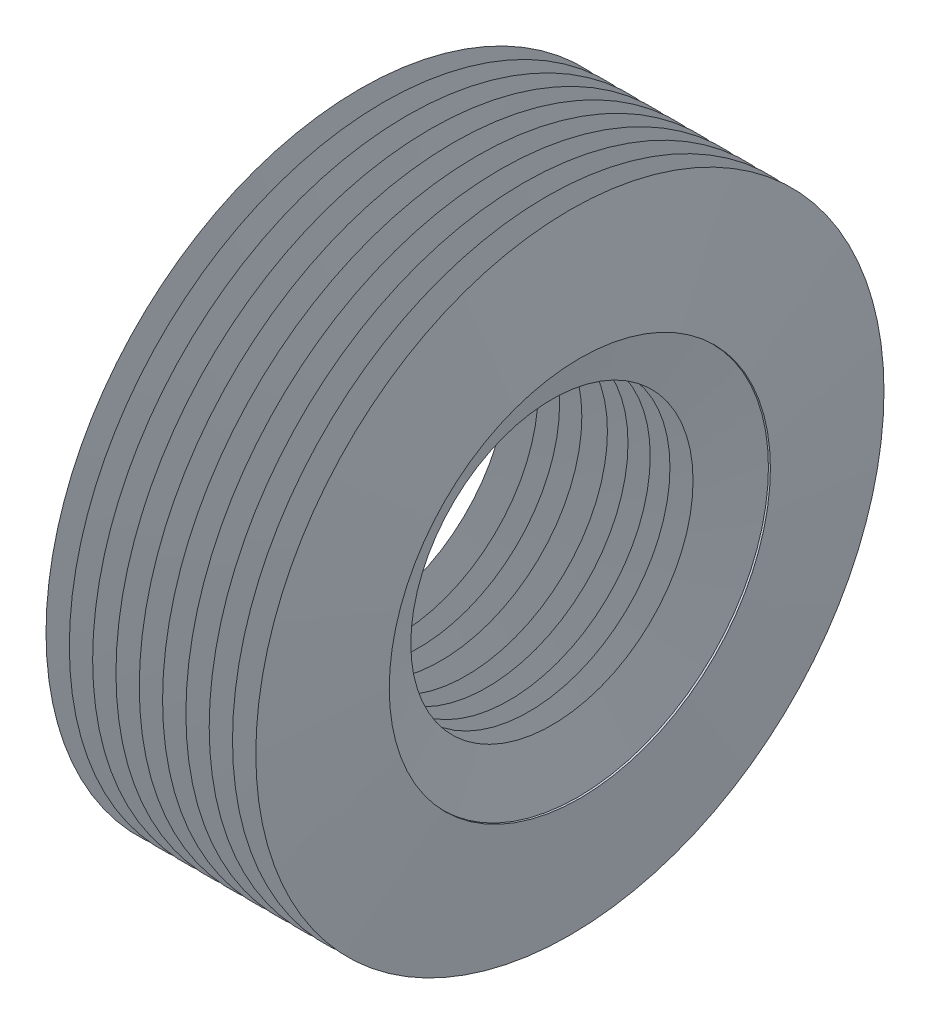
ISO-10303-21;
HEADER;
FILE_DESCRIPTION(('STEP AP214'),'2;1');
FILE_NAME('part.step','',(''),(''),'','','');
FILE_SCHEMA(('AUTOMOTIVE_DESIGN { 1 0 10303 214 1 1 1 1 }'));
ENDSEC;
DATA;
#1=APPLICATION_CONTEXT('core data for automotive mechanical design processes');
#2=APPLICATION_PROTOCOL_DEFINITION('international standard','automotive_design',2000,#1);
#3=PRODUCT_CONTEXT('',#1,'mechanical');
#4=PRODUCT('Part','Part','',(#3));
#5=PRODUCT_RELATED_PRODUCT_CATEGORY('part','',(#4));
#6=PRODUCT_DEFINITION_FORMATION('','',#4);
#7=PRODUCT_DEFINITION_CONTEXT('part definition',#1,'design');
#8=PRODUCT_DEFINITION('design','',#6,#7);
#9=PRODUCT_DEFINITION_SHAPE('','',#8);
#10=(LENGTH_UNIT() NAMED_UNIT(*) SI_UNIT(.MILLI.,.METRE.));
#11=(NAMED_UNIT(*) PLANE_ANGLE_UNIT() SI_UNIT($,.RADIAN.));
#12=(NAMED_UNIT(*) SI_UNIT($,.STERADIAN.) SOLID_ANGLE_UNIT());
#13=UNCERTAINTY_MEASURE_WITH_UNIT(LENGTH_MEASURE(1.E-05),#10,'distance_accuracy_value','');
#14=(GEOMETRIC_REPRESENTATION_CONTEXT(3) GLOBAL_UNCERTAINTY_ASSIGNED_CONTEXT((#13)) GLOBAL_UNIT_ASSIGNED_CONTEXT((#10,
#11,#12)) REPRESENTATION_CONTEXT('',''));
#15=CARTESIAN_POINT('',(0.,0.,0.));
#16=DIRECTION('',(0.,0.,1.));
#17=DIRECTION('',(1.,0.,0.));
#18=AXIS2_PLACEMENT_3D('',#15,#16,#17);
#19=CARTESIAN_POINT('',(1.27478020675698,0.,0.));
#20=DIRECTION('',(-1.,0.,0.));
#21=DIRECTION('',(0.,-1.,0.));
#22=AXIS2_PLACEMENT_3D('',#19,#20,#21);
#23=CONICAL_SURFACE('',#22,11.7519225936863,1.52376665433172);
#24=CARTESIAN_POINT('',(1.55124668778939,0.,0.));
#25=DIRECTION('',(1.,0.,0.));
#26=DIRECTION('',(0.,0.,-1.));
#27=AXIS2_PLACEMENT_3D('',#24,#25,#26);
#28=CIRCLE('',#27,5.87770302365698);
#29=CARTESIAN_POINT('',(1.55124668778939,0.,-5.87770302365698));
#30=VERTEX_POINT('',#29);
#31=EDGE_CURVE('E141',#30,#30,#28,.T.);
#32=ORIENTED_EDGE('',*,*,#31,.T.);
#33=EDGE_LOOP('',(#32));
#34=FACE_BOUND('',#33,.T.);
#35=CARTESIAN_POINT('',(1.27478020675699,0.,0.));
#36=DIRECTION('',(1.,0.,0.));
#37=DIRECTION('',(0.,0.,-1.));
#38=AXIS2_PLACEMENT_3D('',#35,#36,#37);
#39=CIRCLE('',#38,11.7519225936863);
#40=CARTESIAN_POINT('',(1.27478020675699,0.,-11.7519225936863));
#41=VERTEX_POINT('',#40);
#42=EDGE_CURVE('E17',#41,#41,#39,.F.);
#43=ORIENTED_EDGE('',*,*,#42,.T.);
#44=EDGE_LOOP('',(#43));
#45=FACE_BOUND('',#44,.T.);
#46=ADVANCED_FACE('F14',(#34,#45),#23,.F.);
#47=CARTESIAN_POINT('',(1.27478020675699,0.,0.));
#48=DIRECTION('',(1.,0.,0.));
#49=DIRECTION('',(0.,1.,0.));
#50=AXIS2_PLACEMENT_3D('',#47,#48,#49);
#51=CONICAL_SURFACE('',#50,11.7519225936863,1.5031032092826);
#52=CARTESIAN_POINT('',(1.01582547881265,0.,0.));
#53=DIRECTION('',(-1.,0.,0.));
#54=DIRECTION('',(0.,0.,1.));
#55=AXIS2_PLACEMENT_3D('',#52,#53,#54);
#56=CIRCLE('',#55,7.93234572300825);
#57=CARTESIAN_POINT('',(1.01582547881265,0.,7.93234572300825));
#58=VERTEX_POINT('',#57);
#59=EDGE_CURVE('E139',#58,#58,#56,.T.);
#60=ORIENTED_EDGE('',*,*,#59,.T.);
#61=EDGE_LOOP('',(#60));
#62=FACE_BOUND('',#61,.T.);
#63=ORIENTED_EDGE('',*,*,#42,.F.);
#64=EDGE_LOOP('',(#63));
#65=FACE_BOUND('',#64,.T.);
#66=ADVANCED_FACE('F149',(#62,#65),#51,.F.);
#67=CARTESIAN_POINT('',(2.25192698304255,0.,0.));
#68=DIRECTION('',(1.,0.,0.));
#69=DIRECTION('',(0.,1.,0.));
#70=AXIS2_PLACEMENT_3D('',#67,#68,#69);
#71=CONICAL_SURFACE('',#70,12.30922593993,1.4622796088312);
#72=ORIENTED_EDGE('',*,*,#31,.F.);
#73=EDGE_LOOP('',(#72));
#74=FACE_BOUND('',#73,.T.);
#75=CARTESIAN_POINT('',(2.25192698304316,0.,0.));
#76=DIRECTION('',(-1.,0.,0.));
#77=DIRECTION('',(0.,0.,1.));
#78=AXIS2_PLACEMENT_3D('',#75,#76,#77);
#79=CIRCLE('',#78,12.3092259400365);
#80=CARTESIAN_POINT('',(2.25192698304316,0.,12.3092259400365));
#81=VERTEX_POINT('',#80);
#82=EDGE_CURVE('E136',#81,#81,#79,.F.);
#83=ORIENTED_EDGE('',*,*,#82,.T.);
#84=EDGE_LOOP('',(#83));
#85=FACE_BOUND('',#84,.T.);
#86=ADVANCED_FACE('F151',(#74,#85),#71,.F.);
#87=CARTESIAN_POINT('',(0.939800000000007,0.,0.));
#88=DIRECTION('',(-1.,0.,0.));
#89=DIRECTION('',(0.,-1.,0.));
#90=AXIS2_PLACEMENT_3D('',#87,#88,#89);
#91=CONICAL_SURFACE('',#90,7.9375,0.0676931175123013);
#92=ORIENTED_EDGE('',*,*,#59,.F.);
#93=EDGE_LOOP('',(#92));
#94=FACE_BOUND('',#93,.T.);
#95=CARTESIAN_POINT('',(0.939800000000005,0.,0.));
#96=DIRECTION('',(1.,0.,0.));
#97=DIRECTION('',(0.,0.,-1.));
#98=AXIS2_PLACEMENT_3D('',#95,#96,#97);
#99=CIRCLE('',#98,7.9375);
#100=CARTESIAN_POINT('',(0.939800000000005,0.,-7.9375));
#101=VERTEX_POINT('',#100);
#102=EDGE_CURVE('E133',#101,#101,#99,.T.);
#103=ORIENTED_EDGE('',*,*,#102,.F.);
#104=EDGE_LOOP('',(#103));
#105=FACE_BOUND('',#104,.T.);
#106=ADVANCED_FACE('F158',(#94,#105),#91,.F.);
#107=CARTESIAN_POINT('',(2.25192698304316,0.,0.));
#108=DIRECTION('',(-1.,0.,0.));
#109=DIRECTION('',(0.,-1.,0.));
#110=AXIS2_PLACEMENT_3D('',#107,#108,#109);
#111=CONICAL_SURFACE('',#110,12.3092259400365,1.48153287638625);
#112=CARTESIAN_POINT('',(2.82752085367832,0.,0.));
#113=DIRECTION('',(1.,0.,0.));
#114=DIRECTION('',(0.,0.,-1.));
#115=AXIS2_PLACEMENT_3D('',#112,#113,#114);
#116=CIRCLE('',#115,5.87810228330454);
#117=CARTESIAN_POINT('',(2.82752085367832,0.,-5.87810228330454));
#118=VERTEX_POINT('',#117);
#119=EDGE_CURVE('E130',#118,#118,#116,.T.);
#120=ORIENTED_EDGE('',*,*,#119,.T.);
#121=EDGE_LOOP('',(#120));
#122=FACE_BOUND('',#121,.T.);
#123=ORIENTED_EDGE('',*,*,#82,.F.);
#124=EDGE_LOOP('',(#123));
#125=FACE_BOUND('',#124,.T.);
#126=ADVANCED_FACE('F311',(#122,#125),#111,.F.);
#127=CARTESIAN_POINT('',(1.28851235434653,0.,0.));
#128=DIRECTION('',(1.,0.,0.));
#129=DIRECTION('',(0.,1.,0.));
#130=AXIS2_PLACEMENT_3D('',#127,#128,#129);
#131=CONICAL_SURFACE('',#130,13.081,1.5031032092826);
#132=CARTESIAN_POINT('',(1.28851235434653,0.,0.));
#133=DIRECTION('',(-1.,0.,0.));
#134=DIRECTION('',(0.,0.,1.));
#135=AXIS2_PLACEMENT_3D('',#132,#133,#134);
#136=CIRCLE('',#135,13.081);
#137=CARTESIAN_POINT('',(1.28851235434653,0.,13.081));
#138=VERTEX_POINT('',#137);
#139=EDGE_CURVE('E127',#138,#138,#136,.F.);
#140=ORIENTED_EDGE('',*,*,#139,.F.);
#141=EDGE_LOOP('',(#140));
#142=FACE_BOUND('',#141,.T.);
#143=ORIENTED_EDGE('',*,*,#102,.T.);
#144=EDGE_LOOP('',(#143));
#145=FACE_BOUND('',#144,.T.);
#146=ADVANCED_FACE('F307',(#142,#145),#131,.T.);
#147=CARTESIAN_POINT('',(3.23648234410712,0.,0.));
#148=DIRECTION('',(1.,0.,0.));
#149=DIRECTION('',(0.,1.,0.));
#150=AXIS2_PLACEMENT_3D('',#147,#148,#149);
#151=CONICAL_SURFACE('',#150,12.0271798123213,1.50438634913583);
#152=ORIENTED_EDGE('',*,*,#119,.F.);
#153=EDGE_LOOP('',(#152));
#154=FACE_BOUND('',#153,.T.);
#155=CARTESIAN_POINT('',(3.23648234409971,0.,0.));
#156=DIRECTION('',(-1.,0.,0.));
#157=DIRECTION('',(0.,0.,1.));
#158=AXIS2_PLACEMENT_3D('',#155,#156,#157);
#159=CIRCLE('',#158,12.0271798123064);
#160=CARTESIAN_POINT('',(3.23648234409971,0.,12.0271798123064));
#161=VERTEX_POINT('',#160);
#162=EDGE_CURVE('E124',#161,#161,#159,.F.);
#163=ORIENTED_EDGE('',*,*,#162,.T.);
#164=EDGE_LOOP('',(#163));
#165=FACE_BOUND('',#164,.T.);
#166=ADVANCED_FACE('F303',(#154,#165),#151,.F.);
#167=CARTESIAN_POINT('',(1.28851235434653,0.,0.));
#168=DIRECTION('',(-1.,0.,0.));
#169=DIRECTION('',(0.,-1.,0.));
#170=AXIS2_PLACEMENT_3D('',#167,#168,#169);
#171=CONICAL_SURFACE('',#170,13.081,1.52376665433172);
#172=ORIENTED_EDGE('',*,*,#139,.T.);
#173=EDGE_LOOP('',(#172));
#174=FACE_BOUND('',#173,.T.);
#175=CARTESIAN_POINT('',(1.58139396881296,0.,0.));
#176=DIRECTION('',(1.,0.,0.));
#177=DIRECTION('',(0.,0.,-1.));
#178=AXIS2_PLACEMENT_3D('',#175,#176,#177);
#179=CIRCLE('',#178,6.85800000002246);
#180=CARTESIAN_POINT('',(1.58139396881296,0.,-6.85800000002246));
#181=VERTEX_POINT('',#180);
#182=EDGE_CURVE('E121',#181,#181,#179,.T.);
#183=ORIENTED_EDGE('',*,*,#182,.F.);
#184=EDGE_LOOP('',(#183));
#185=FACE_BOUND('',#184,.T.);
#186=ADVANCED_FACE('F299',(#174,#185),#171,.T.);
#187=CARTESIAN_POINT('',(3.23648234409971,0.,0.));
#188=DIRECTION('',(-1.,0.,0.));
#189=DIRECTION('',(0.,-1.,0.));
#190=AXIS2_PLACEMENT_3D('',#187,#188,#189);
#191=CONICAL_SURFACE('',#190,12.0271798123064,1.49246585917078);
#192=CARTESIAN_POINT('',(3.71912497512739,0.,0.));
#193=DIRECTION('',(1.,0.,0.));
#194=DIRECTION('',(0.,0.,-1.));
#195=AXIS2_PLACEMENT_3D('',#192,#193,#194);
#196=CIRCLE('',#195,5.87816614074654);
#197=CARTESIAN_POINT('',(3.71912497512739,0.,-5.87816614074654));
#198=VERTEX_POINT('',#197);
#199=EDGE_CURVE('E118',#198,#198,#196,.T.);
#200=ORIENTED_EDGE('',*,*,#199,.T.);
#201=EDGE_LOOP('',(#200));
#202=FACE_BOUND('',#201,.T.);
#203=ORIENTED_EDGE('',*,*,#162,.F.);
#204=EDGE_LOOP('',(#203));
#205=FACE_BOUND('',#204,.T.);
#206=ADVANCED_FACE('F295',(#202,#205),#191,.F.);
#207=CARTESIAN_POINT('',(2.2593567987883,0.,0.));
#208=DIRECTION('',(1.,0.,0.));
#209=DIRECTION('',(0.,1.,0.));
#210=AXIS2_PLACEMENT_3D('',#207,#208,#209);
#211=CONICAL_SURFACE('',#210,13.0809999999997,1.46227960883077);
#212=CARTESIAN_POINT('',(2.25935679879097,0.,0.));
#213=DIRECTION('',(-1.,0.,0.));
#214=DIRECTION('',(0.,0.,1.));
#215=AXIS2_PLACEMENT_3D('',#212,#213,#214);
#216=CIRCLE('',#215,13.081);
#217=CARTESIAN_POINT('',(2.25935679879097,0.,13.081));
#218=VERTEX_POINT('',#217);
#219=EDGE_CURVE('E115',#218,#218,#216,.F.);
#220=ORIENTED_EDGE('',*,*,#219,.F.);
#221=EDGE_LOOP('',(#220));
#222=FACE_BOUND('',#221,.T.);
#223=ORIENTED_EDGE('',*,*,#182,.T.);
#224=EDGE_LOOP('',(#223));
#225=FACE_BOUND('',#224,.T.);
#226=ADVANCED_FACE('F291',(#222,#225),#211,.T.);
#227=CARTESIAN_POINT('',(4.19840654571146,0.,0.));
#228=DIRECTION('',(1.,0.,0.));
#229=DIRECTION('',(0.,1.,0.));
#230=AXIS2_PLACEMENT_3D('',#227,#228,#229);
#231=CONICAL_SURFACE('',#230,12.0610080238635,1.49343303358597);
#232=ORIENTED_EDGE('',*,*,#199,.F.);
#233=EDGE_LOOP('',(#232));
#234=FACE_BOUND('',#233,.T.);
#235=CARTESIAN_POINT('',(4.19840654571653,0.,0.));
#236=DIRECTION('',(-1.,0.,0.));
#237=DIRECTION('',(0.,0.,1.));
#238=AXIS2_PLACEMENT_3D('',#235,#236,#237);
#239=CIRCLE('',#238,12.0610080239029);
#240=CARTESIAN_POINT('',(4.19840654571653,0.,12.0610080239029));
#241=VERTEX_POINT('',#240);
#242=EDGE_CURVE('E112',#241,#241,#239,.F.);
#243=ORIENTED_EDGE('',*,*,#242,.T.);
#244=EDGE_LOOP('',(#243));
#245=FACE_BOUND('',#244,.T.);
#246=ADVANCED_FACE('F287',(#234,#245),#231,.F.);
#247=CARTESIAN_POINT('',(2.25935679879097,0.,0.));
#248=DIRECTION('',(-1.,0.,0.));
#249=DIRECTION('',(0.,-1.,0.));
#250=AXIS2_PLACEMENT_3D('',#247,#248,#249);
#251=CONICAL_SURFACE('',#250,13.081,1.48153287638625);
#252=ORIENTED_EDGE('',*,*,#219,.T.);
#253=EDGE_LOOP('',(#252));
#254=FACE_BOUND('',#253,.T.);
#255=CARTESIAN_POINT('',(2.81632333343396,0.,0.));
#256=DIRECTION('',(1.,0.,0.));
#257=DIRECTION('',(0.,0.,-1.));
#258=AXIS2_PLACEMENT_3D('',#255,#256,#257);
#259=CIRCLE('',#258,6.85800000002246);
#260=CARTESIAN_POINT('',(2.81632333343396,0.,-6.85800000002246));
#261=VERTEX_POINT('',#260);
#262=EDGE_CURVE('E109',#261,#261,#259,.T.);
#263=ORIENTED_EDGE('',*,*,#262,.F.);
#264=EDGE_LOOP('',(#263));
#265=FACE_BOUND('',#264,.T.);
#266=ADVANCED_FACE('F283',(#254,#265),#251,.T.);
#267=CARTESIAN_POINT('',(4.19840654571653,0.,0.));
#268=DIRECTION('',(-1.,0.,0.));
#269=DIRECTION('',(0.,-1.,0.));
#270=AXIS2_PLACEMENT_3D('',#267,#268,#269);
#271=CONICAL_SURFACE('',#270,12.0610080239029,1.49860785091006);
#272=CARTESIAN_POINT('',(4.64551452374451,0.,0.));
#273=DIRECTION('',(1.,0.,0.));
#274=DIRECTION('',(0.,0.,-1.));
#275=AXIS2_PLACEMENT_3D('',#272,#273,#274);
#276=CIRCLE('',#275,5.87815058293018);
#277=CARTESIAN_POINT('',(4.64551452374451,0.,-5.87815058293018));
#278=VERTEX_POINT('',#277);
#279=EDGE_CURVE('E106',#278,#278,#276,.T.);
#280=ORIENTED_EDGE('',*,*,#279,.T.);
#281=EDGE_LOOP('',(#280));
#282=FACE_BOUND('',#281,.T.);
#283=ORIENTED_EDGE('',*,*,#242,.F.);
#284=EDGE_LOOP('',(#283));
#285=FACE_BOUND('',#284,.T.);
#286=ADVANCED_FACE('F279',(#282,#285),#271,.F.);
#287=CARTESIAN_POINT('',(3.23020124323392,0.,0.));
#288=DIRECTION('',(1.,0.,0.));
#289=DIRECTION('',(0.,1.,0.));
#290=AXIS2_PLACEMENT_3D('',#287,#288,#289);
#291=CONICAL_SURFACE('',#290,13.0809999999428,1.50438634913572);
#292=CARTESIAN_POINT('',(3.2302012432354,0.,0.));
#293=DIRECTION('',(-1.,0.,0.));
#294=DIRECTION('',(0.,0.,1.));
#295=AXIS2_PLACEMENT_3D('',#292,#293,#294);
#296=CIRCLE('',#295,13.081);
#297=CARTESIAN_POINT('',(3.2302012432354,0.,13.081));
#298=VERTEX_POINT('',#297);
#299=EDGE_CURVE('E103',#298,#298,#296,.F.);
#300=ORIENTED_EDGE('',*,*,#299,.F.);
#301=EDGE_LOOP('',(#300));
#302=FACE_BOUND('',#301,.T.);
#303=ORIENTED_EDGE('',*,*,#262,.T.);
#304=EDGE_LOOP('',(#303));
#305=FACE_BOUND('',#304,.T.);
#306=ADVANCED_FACE('F275',(#302,#305),#291,.T.);
#307=CARTESIAN_POINT('',(5.17268703038809,0.,0.));
#308=DIRECTION('',(1.,0.,0.));
#309=DIRECTION('',(0.,1.,0.));
#310=AXIS2_PLACEMENT_3D('',#307,#308,#309);
#311=CONICAL_SURFACE('',#310,12.1768889111422,1.48729599596356);
#312=ORIENTED_EDGE('',*,*,#279,.F.);
#313=EDGE_LOOP('',(#312));
#314=FACE_BOUND('',#313,.T.);
#315=CARTESIAN_POINT('',(5.17268703040133,0.,0.));
#316=DIRECTION('',(-1.,0.,0.));
#317=DIRECTION('',(0.,0.,1.));
#318=AXIS2_PLACEMENT_3D('',#315,#316,#317);
#319=CIRCLE('',#318,12.1768889112928);
#320=CARTESIAN_POINT('',(5.17268703040133,0.,12.1768889112928));
#321=VERTEX_POINT('',#320);
#322=EDGE_CURVE('E100',#321,#321,#319,.F.);
#323=ORIENTED_EDGE('',*,*,#322,.T.);
#324=EDGE_LOOP('',(#323));
#325=FACE_BOUND('',#324,.T.);
#326=ADVANCED_FACE('F271',(#314,#325),#311,.F.);
#327=CARTESIAN_POINT('',(3.2302012432354,0.,0.));
#328=DIRECTION('',(-1.,0.,0.));
#329=DIRECTION('',(0.,-1.,0.));
#330=AXIS2_PLACEMENT_3D('',#327,#328,#329);
#331=CONICAL_SURFACE('',#330,13.081,1.49246585917078);
#332=ORIENTED_EDGE('',*,*,#299,.T.);
#333=EDGE_LOOP('',(#332));
#334=FACE_BOUND('',#333,.T.);
#335=CARTESIAN_POINT('',(3.71865113998382,0.,0.));
#336=DIRECTION('',(1.,0.,0.));
#337=DIRECTION('',(0.,0.,-1.));
#338=AXIS2_PLACEMENT_3D('',#335,#336,#337);
#339=CIRCLE('',#338,6.85800000002246);
#340=CARTESIAN_POINT('',(3.71865113998382,0.,-6.85800000002246));
#341=VERTEX_POINT('',#340);
#342=EDGE_CURVE('E97',#341,#341,#339,.T.);
#343=ORIENTED_EDGE('',*,*,#342,.F.);
#344=EDGE_LOOP('',(#343));
#345=FACE_BOUND('',#344,.T.);
#346=ADVANCED_FACE('F267',(#334,#345),#331,.T.);
#347=CARTESIAN_POINT('',(5.17268703040133,0.,0.));
#348=DIRECTION('',(-1.,0.,0.));
#349=DIRECTION('',(0.,-1.,0.));
#350=AXIS2_PLACEMENT_3D('',#347,#348,#349);
#351=CONICAL_SURFACE('',#350,12.1768889112928,1.48553316376188);
#352=CARTESIAN_POINT('',(5.71104356271945,0.,0.));
#353=DIRECTION('',(1.,0.,0.));
#354=DIRECTION('',(0.,0.,-1.));
#355=AXIS2_PLACEMENT_3D('',#352,#353,#354);
#356=CIRCLE('',#355,5.87813927762681);
#357=CARTESIAN_POINT('',(5.71104356271945,0.,-5.87813927762681));
#358=VERTEX_POINT('',#357);
#359=EDGE_CURVE('E94',#358,#358,#356,.T.);
#360=ORIENTED_EDGE('',*,*,#359,.T.);
#361=EDGE_LOOP('',(#360));
#362=FACE_BOUND('',#361,.T.);
#363=ORIENTED_EDGE('',*,*,#322,.F.);
#364=EDGE_LOOP('',(#363));
#365=FACE_BOUND('',#364,.T.);
#366=ADVANCED_FACE('F263',(#362,#365),#351,.F.);
#367=CARTESIAN_POINT('',(4.20104568767243,0.,0.));
#368=DIRECTION('',(1.,0.,0.));
#369=DIRECTION('',(0.,1.,0.));
#370=AXIS2_PLACEMENT_3D('',#367,#368,#369);
#371=CONICAL_SURFACE('',#370,13.080999999886,1.49343303358735);
#372=CARTESIAN_POINT('',(4.20104568767986,0.,0.));
#373=DIRECTION('',(-1.,0.,0.));
#374=DIRECTION('',(0.,0.,1.));
#375=AXIS2_PLACEMENT_3D('',#372,#373,#374);
#376=CIRCLE('',#375,13.081);
#377=CARTESIAN_POINT('',(4.20104568767986,0.,13.081));
#378=VERTEX_POINT('',#377);
#379=EDGE_CURVE('E91',#378,#378,#376,.F.);
#380=ORIENTED_EDGE('',*,*,#379,.F.);
#381=EDGE_LOOP('',(#380));
#382=FACE_BOUND('',#381,.T.);
#383=ORIENTED_EDGE('',*,*,#342,.T.);
#384=EDGE_LOOP('',(#383));
#385=FACE_BOUND('',#384,.T.);
#386=ADVANCED_FACE('F259',(#382,#385),#371,.T.);
#387=CARTESIAN_POINT('',(6.14224008010922,0.,0.));
#388=DIRECTION('',(1.,0.,0.));
#389=DIRECTION('',(0.,1.,0.));
#390=AXIS2_PLACEMENT_3D('',#387,#388,#389);
#391=CONICAL_SURFACE('',#390,11.9910472855054,1.50037428294446);
#392=ORIENTED_EDGE('',*,*,#359,.F.);
#393=EDGE_LOOP('',(#392));
#394=FACE_BOUND('',#393,.T.);
#395=CARTESIAN_POINT('',(6.14224008012973,0.,0.));
#396=DIRECTION('',(-1.,0.,0.));
#397=DIRECTION('',(0.,0.,1.));
#398=AXIS2_PLACEMENT_3D('',#395,#396,#397);
#399=CIRCLE('',#398,11.9910472857451);
#400=CARTESIAN_POINT('',(6.14224008012973,0.,11.9910472857451));
#401=VERTEX_POINT('',#400);
#402=EDGE_CURVE('E88',#401,#401,#399,.F.);
#403=ORIENTED_EDGE('',*,*,#402,.T.);
#404=EDGE_LOOP('',(#403));
#405=FACE_BOUND('',#404,.T.);
#406=ADVANCED_FACE('F255',(#394,#405),#391,.F.);
#407=CARTESIAN_POINT('',(4.20104568767986,0.,0.));
#408=DIRECTION('',(-1.,0.,0.));
#409=DIRECTION('',(0.,-1.,0.));
#410=AXIS2_PLACEMENT_3D('',#407,#408,#409);
#411=CONICAL_SURFACE('',#410,13.081,1.49860785091006);
#412=ORIENTED_EDGE('',*,*,#379,.T.);
#413=EDGE_LOOP('',(#412));
#414=FACE_BOUND('',#413,.T.);
#415=CARTESIAN_POINT('',(4.65105654008369,0.,0.));
#416=DIRECTION('',(1.,0.,0.));
#417=DIRECTION('',(0.,0.,-1.));
#418=AXIS2_PLACEMENT_3D('',#415,#416,#417);
#419=CIRCLE('',#418,6.85800000002246);
#420=CARTESIAN_POINT('',(4.65105654008369,0.,-6.85800000002246));
#421=VERTEX_POINT('',#420);
#422=EDGE_CURVE('E85',#421,#421,#419,.T.);
#423=ORIENTED_EDGE('',*,*,#422,.F.);
#424=EDGE_LOOP('',(#423));
#425=FACE_BOUND('',#424,.T.);
#426=ADVANCED_FACE('F251',(#414,#425),#411,.T.);
#427=CARTESIAN_POINT('',(6.14224008012973,0.,0.));
#428=DIRECTION('',(-1.,0.,0.));
#429=DIRECTION('',(0.,-1.,0.));
#430=AXIS2_PLACEMENT_3D('',#427,#428,#429);
#431=CONICAL_SURFACE('',#430,11.9910472857451,1.50128165516091);
#432=CARTESIAN_POINT('',(6.5678631580397,0.,0.));
#433=DIRECTION('',(1.,0.,0.));
#434=DIRECTION('',(0.,0.,-1.));
#435=AXIS2_PLACEMENT_3D('',#432,#433,#434);
#436=CIRCLE('',#435,5.87813228554523);
#437=CARTESIAN_POINT('',(6.5678631580397,0.,-5.87813228554523));
#438=VERTEX_POINT('',#437);
#439=EDGE_CURVE('E82',#438,#438,#436,.T.);
#440=ORIENTED_EDGE('',*,*,#439,.T.);
#441=EDGE_LOOP('',(#440));
#442=FACE_BOUND('',#441,.T.);
#443=ORIENTED_EDGE('',*,*,#402,.F.);
#444=EDGE_LOOP('',(#443));
#445=FACE_BOUND('',#444,.T.);
#446=ADVANCED_FACE('F247',(#442,#445),#431,.F.);
#447=CARTESIAN_POINT('',(5.17189013211805,0.,0.));
#448=DIRECTION('',(1.,0.,0.));
#449=DIRECTION('',(0.,1.,0.));
#450=AXIS2_PLACEMENT_3D('',#447,#448,#449);
#451=CONICAL_SURFACE('',#450,13.080999999886,1.48729599596441);
#452=CARTESIAN_POINT('',(5.1718901321243,0.,0.));
#453=DIRECTION('',(-1.,0.,0.));
#454=DIRECTION('',(0.,0.,1.));
#455=AXIS2_PLACEMENT_3D('',#452,#453,#454);
#456=CIRCLE('',#455,13.081);
#457=CARTESIAN_POINT('',(5.1718901321243,0.,13.081));
#458=VERTEX_POINT('',#457);
#459=EDGE_CURVE('E79',#458,#458,#456,.F.);
#460=ORIENTED_EDGE('',*,*,#459,.F.);
#461=EDGE_LOOP('',(#460));
#462=FACE_BOUND('',#461,.T.);
#463=ORIENTED_EDGE('',*,*,#422,.T.);
#464=EDGE_LOOP('',(#463));
#465=FACE_BOUND('',#464,.T.);
#466=ADVANCED_FACE('F243',(#462,#465),#451,.T.);
#467=CARTESIAN_POINT('',(7.10194819691878,0.,0.));
#468=DIRECTION('',(1.,0.,0.));
#469=DIRECTION('',(0.,1.,0.));
#470=AXIS2_PLACEMENT_3D('',#467,#468,#469);
#471=CONICAL_SURFACE('',#470,12.0609451363975,1.48462801788883);
#472=ORIENTED_EDGE('',*,*,#439,.F.);
#473=EDGE_LOOP('',(#472));
#474=FACE_BOUND('',#473,.T.);
#475=CARTESIAN_POINT('',(7.10194819692997,0.,0.));
#476=DIRECTION('',(-1.,0.,0.));
#477=DIRECTION('',(0.,0.,1.));
#478=AXIS2_PLACEMENT_3D('',#475,#476,#477);
#479=CIRCLE('',#478,12.0609451364439);
#480=CARTESIAN_POINT('',(7.10194819692997,0.,12.0609451364439));
#481=VERTEX_POINT('',#480);
#482=EDGE_CURVE('E76',#481,#481,#479,.F.);
#483=ORIENTED_EDGE('',*,*,#482,.T.);
#484=EDGE_LOOP('',(#483));
#485=FACE_BOUND('',#484,.T.);
#486=ADVANCED_FACE('F239',(#474,#485),#471,.F.);
#487=CARTESIAN_POINT('',(5.1718901321243,0.,0.));
#488=DIRECTION('',(-1.,0.,0.));
#489=DIRECTION('',(0.,-1.,0.));
#490=AXIS2_PLACEMENT_3D('',#487,#488,#489);
#491=CONICAL_SURFACE('',#490,13.081,1.48553316376188);
#492=ORIENTED_EDGE('',*,*,#459,.T.);
#493=EDGE_LOOP('',(#492));
#494=FACE_BOUND('',#493,.T.);
#495=CARTESIAN_POINT('',(5.70377231437647,0.,0.));
#496=DIRECTION('',(1.,0.,0.));
#497=DIRECTION('',(0.,0.,-1.));
#498=AXIS2_PLACEMENT_3D('',#495,#496,#497);
#499=CIRCLE('',#498,6.85800000002246);
#500=CARTESIAN_POINT('',(5.70377231437647,0.,-6.85800000002246));
#501=VERTEX_POINT('',#500);
#502=EDGE_CURVE('E73',#501,#501,#499,.T.);
#503=ORIENTED_EDGE('',*,*,#502,.F.);
#504=EDGE_LOOP('',(#503));
#505=FACE_BOUND('',#504,.T.);
#506=ADVANCED_FACE('F235',(#494,#505),#491,.T.);
#507=CARTESIAN_POINT('',(7.10194819692997,0.,0.));
#508=DIRECTION('',(-1.,0.,0.));
#509=DIRECTION('',(0.,-1.,0.));
#510=AXIS2_PLACEMENT_3D('',#507,#508,#509);
#511=CONICAL_SURFACE('',#510,12.0609451364439,1.5074313405337);
#512=CARTESIAN_POINT('',(7.49425158149819,0.,0.));
#513=DIRECTION('',(1.,0.,0.));
#514=DIRECTION('',(0.,0.,-1.));
#515=AXIS2_PLACEMENT_3D('',#512,#513,#514);
#516=CIRCLE('',#515,5.87806372976729);
#517=CARTESIAN_POINT('',(7.49425158149819,0.,-5.87806372976729));
#518=VERTEX_POINT('',#517);
#519=EDGE_CURVE('E70',#518,#518,#516,.T.);
#520=ORIENTED_EDGE('',*,*,#519,.T.);
#521=EDGE_LOOP('',(#520));
#522=FACE_BOUND('',#521,.T.);
#523=ORIENTED_EDGE('',*,*,#482,.F.);
#524=EDGE_LOOP('',(#523));
#525=FACE_BOUND('',#524,.T.);
#526=ADVANCED_FACE('F231',(#522,#525),#511,.F.);
#527=CARTESIAN_POINT('',(6.14273457656367,0.,0.));
#528=DIRECTION('',(1.,0.,0.));
#529=DIRECTION('',(0.,1.,0.));
#530=AXIS2_PLACEMENT_3D('',#527,#528,#529);
#531=CONICAL_SURFACE('',#530,13.0809999999428,1.50037428294435);
#532=CARTESIAN_POINT('',(6.14273457656874,0.,0.));
#533=DIRECTION('',(-1.,0.,0.));
#534=DIRECTION('',(0.,0.,1.));
#535=AXIS2_PLACEMENT_3D('',#532,#533,#534);
#536=CIRCLE('',#535,13.0809999999993);
#537=CARTESIAN_POINT('',(6.14273457656874,0.,13.0809999999993));
#538=VERTEX_POINT('',#537);
#539=EDGE_CURVE('E67',#538,#538,#536,.F.);
#540=ORIENTED_EDGE('',*,*,#539,.F.);
#541=EDGE_LOOP('',(#540));
#542=FACE_BOUND('',#541,.T.);
#543=ORIENTED_EDGE('',*,*,#502,.T.);
#544=EDGE_LOOP('',(#543));
#545=FACE_BOUND('',#544,.T.);
#546=ADVANCED_FACE('F227',(#542,#545),#531,.T.);
#547=CARTESIAN_POINT('',(8.05644630268887,0.,0.));
#548=DIRECTION('',(1.,0.,0.));
#549=DIRECTION('',(0.,1.,0.));
#550=AXIS2_PLACEMENT_3D('',#547,#548,#549);
#551=CONICAL_SURFACE('',#550,11.9519610418024,1.47850015883687);
#552=ORIENTED_EDGE('',*,*,#519,.F.);
#553=EDGE_LOOP('',(#552));
#554=FACE_BOUND('',#553,.T.);
#555=CARTESIAN_POINT('',(8.05644630267469,0.,0.));
#556=DIRECTION('',(-1.,0.,0.));
#557=DIRECTION('',(0.,0.,1.));
#558=AXIS2_PLACEMENT_3D('',#555,#556,#557);
#559=CIRCLE('',#558,11.9519610417521);
#560=CARTESIAN_POINT('',(8.05644630267469,0.,11.9519610417521));
#561=VERTEX_POINT('',#560);
#562=EDGE_CURVE('E64',#561,#561,#559,.F.);
#563=ORIENTED_EDGE('',*,*,#562,.T.);
#564=EDGE_LOOP('',(#563));
#565=FACE_BOUND('',#564,.T.);
#566=ADVANCED_FACE('F223',(#554,#565),#551,.F.);
#567=CARTESIAN_POINT('',(6.14273457656874,0.,0.));
#568=DIRECTION('',(-1.,0.,0.));
#569=DIRECTION('',(0.,-1.,0.));
#570=AXIS2_PLACEMENT_3D('',#567,#568,#569);
#571=CONICAL_SURFACE('',#570,13.0809999999993,1.50128165516091);
#572=ORIENTED_EDGE('',*,*,#539,.T.);
#573=EDGE_LOOP('',(#572));
#574=FACE_BOUND('',#573,.T.);
#575=CARTESIAN_POINT('',(6.57602252737632,0.,0.));
#576=DIRECTION('',(1.,0.,0.));
#577=DIRECTION('',(0.,0.,-1.));
#578=AXIS2_PLACEMENT_3D('',#575,#576,#577);
#579=CIRCLE('',#578,6.85800000002246);
#580=CARTESIAN_POINT('',(6.57602252737632,0.,-6.85800000002246));
#581=VERTEX_POINT('',#580);
#582=EDGE_CURVE('E61',#581,#581,#579,.T.);
#583=ORIENTED_EDGE('',*,*,#582,.F.);
#584=EDGE_LOOP('',(#583));
#585=FACE_BOUND('',#584,.T.);
#586=ADVANCED_FACE('F219',(#574,#585),#571,.T.);
#587=CARTESIAN_POINT('',(8.05644630267469,0.,0.));
#588=DIRECTION('',(-1.,0.,0.));
#589=DIRECTION('',(0.,-1.,0.));
#590=AXIS2_PLACEMENT_3D('',#587,#588,#589);
#591=CONICAL_SURFACE('',#590,11.9519610417521,1.52804927034691);
#592=CARTESIAN_POINT('',(8.31626710211708,0.,0.));
#593=DIRECTION('',(1.,0.,0.));
#594=DIRECTION('',(0.,0.,-1.));
#595=AXIS2_PLACEMENT_3D('',#592,#593,#594);
#596=CIRCLE('',#595,5.87756565744257);
#597=CARTESIAN_POINT('',(8.31626710211708,0.,-5.87756565744257));
#598=VERTEX_POINT('',#597);
#599=EDGE_CURVE('E58',#598,#598,#596,.T.);
#600=ORIENTED_EDGE('',*,*,#599,.T.);
#601=EDGE_LOOP('',(#600));
#602=FACE_BOUND('',#601,.T.);
#603=ORIENTED_EDGE('',*,*,#562,.F.);
#604=EDGE_LOOP('',(#603));
#605=FACE_BOUND('',#604,.T.);
#606=ADVANCED_FACE('F215',(#602,#605),#591,.F.);
#607=CARTESIAN_POINT('',(7.11357902100929,0.,0.));
#608=DIRECTION('',(1.,0.,0.));
#609=DIRECTION('',(0.,1.,0.));
#610=AXIS2_PLACEMENT_3D('',#607,#608,#609);
#611=CONICAL_SURFACE('',#610,13.0809999999428,1.48462801788906);
#612=CARTESIAN_POINT('',(7.11357902101316,0.,0.));
#613=DIRECTION('',(-1.,0.,0.));
#614=DIRECTION('',(0.,0.,1.));
#615=AXIS2_PLACEMENT_3D('',#612,#613,#614);
#616=CIRCLE('',#615,13.0809999999998);
#617=CARTESIAN_POINT('',(7.11357902101316,0.,13.0809999999998));
#618=VERTEX_POINT('',#617);
#619=EDGE_CURVE('E55',#618,#618,#616,.F.);
#620=ORIENTED_EDGE('',*,*,#619,.F.);
#621=EDGE_LOOP('',(#620));
#622=FACE_BOUND('',#621,.T.);
#623=ORIENTED_EDGE('',*,*,#582,.T.);
#624=EDGE_LOOP('',(#623));
#625=FACE_BOUND('',#624,.T.);
#626=ADVANCED_FACE('F211',(#622,#625),#611,.T.);
#627=CARTESIAN_POINT('',(9.0199731421805,0.,0.));
#628=DIRECTION('',(1.,0.,0.));
#629=DIRECTION('',(0.,1.,0.));
#630=AXIS2_PLACEMENT_3D('',#627,#628,#629);
#631=CONICAL_SURFACE('',#630,12.0920761020216,1.45804066454441);
#632=ORIENTED_EDGE('',*,*,#599,.F.);
#633=EDGE_LOOP('',(#632));
#634=FACE_BOUND('',#633,.T.);
#635=CARTESIAN_POINT('',(9.01997314217942,0.,0.));
#636=DIRECTION('',(-1.,0.,0.));
#637=DIRECTION('',(0.,0.,1.));
#638=AXIS2_PLACEMENT_3D('',#635,#636,#637);
#639=CIRCLE('',#638,12.092076101997);
#640=CARTESIAN_POINT('',(9.01997314217942,0.,12.092076101997));
#641=VERTEX_POINT('',#640);
#642=EDGE_CURVE('E52',#641,#641,#639,.F.);
#643=ORIENTED_EDGE('',*,*,#642,.T.);
#644=EDGE_LOOP('',(#643));
#645=FACE_BOUND('',#644,.T.);
#646=ADVANCED_FACE('F207',(#634,#645),#631,.F.);
#647=CARTESIAN_POINT('',(7.11357902101316,0.,0.));
#648=DIRECTION('',(-1.,0.,0.));
#649=DIRECTION('',(0.,-1.,0.));
#650=AXIS2_PLACEMENT_3D('',#647,#648,#649);
#651=CONICAL_SURFACE('',#650,13.0809999999998,1.5074313405337);
#652=ORIENTED_EDGE('',*,*,#619,.T.);
#653=EDGE_LOOP('',(#652));
#654=FACE_BOUND('',#653,.T.);
#655=CARTESIAN_POINT('',(7.50842792746909,0.,0.));
#656=DIRECTION('',(1.,0.,0.));
#657=DIRECTION('',(0.,0.,-1.));
#658=AXIS2_PLACEMENT_3D('',#655,#656,#657);
#659=CIRCLE('',#658,6.85800000002246);
#660=CARTESIAN_POINT('',(7.50842792746909,0.,-6.85800000002246));
#661=VERTEX_POINT('',#660);
#662=EDGE_CURVE('E49',#661,#661,#659,.T.);
#663=ORIENTED_EDGE('',*,*,#662,.F.);
#664=EDGE_LOOP('',(#663));
#665=FACE_BOUND('',#664,.T.);
#666=ADVANCED_FACE('F203',(#654,#665),#651,.T.);
#667=CARTESIAN_POINT('',(9.01997314217942,0.,0.));
#668=DIRECTION('',(-1.,0.,0.));
#669=DIRECTION('',(0.,-1.,0.));
#670=AXIS2_PLACEMENT_3D('',#667,#668,#669);
#671=CONICAL_SURFACE('',#670,12.092076101997,1.52939052937714);
#672=CARTESIAN_POINT('',(9.27743898847666,0.,0.));
#673=DIRECTION('',(1.,0.,0.));
#674=DIRECTION('',(0.,0.,-1.));
#675=AXIS2_PLACEMENT_3D('',#672,#673,#674);
#676=CIRCLE('',#675,5.87751898837041);
#677=CARTESIAN_POINT('',(9.27743898847666,0.,-5.87751898837041));
#678=VERTEX_POINT('',#677);
#679=EDGE_CURVE('E46',#678,#678,#676,.T.);
#680=ORIENTED_EDGE('',*,*,#679,.T.);
#681=EDGE_LOOP('',(#680));
#682=FACE_BOUND('',#681,.T.);
#683=ORIENTED_EDGE('',*,*,#642,.F.);
#684=EDGE_LOOP('',(#683));
#685=FACE_BOUND('',#684,.T.);
#686=ADVANCED_FACE('F199',(#682,#685),#671,.F.);
#687=CARTESIAN_POINT('',(8.08442346544069,0.,0.));
#688=DIRECTION('',(1.,0.,0.));
#689=DIRECTION('',(0.,1.,0.));
#690=AXIS2_PLACEMENT_3D('',#687,#688,#689);
#691=CONICAL_SURFACE('',#690,13.0809999997723,1.47850015883649);
#692=CARTESIAN_POINT('',(8.08442346545759,0.,0.));
#693=DIRECTION('',(-1.,0.,0.));
#694=DIRECTION('',(0.,0.,1.));
#695=AXIS2_PLACEMENT_3D('',#692,#693,#694);
#696=CIRCLE('',#695,13.0810000000001);
#697=CARTESIAN_POINT('',(8.08442346545759,0.,13.0810000000001));
#698=VERTEX_POINT('',#697);
#699=EDGE_CURVE('E43',#698,#698,#696,.F.);
#700=ORIENTED_EDGE('',*,*,#699,.F.);
#701=EDGE_LOOP('',(#700));
#702=FACE_BOUND('',#701,.T.);
#703=ORIENTED_EDGE('',*,*,#662,.T.);
#704=EDGE_LOOP('',(#703));
#705=FACE_BOUND('',#704,.T.);
#706=ADVANCED_FACE('F195',(#702,#705),#691,.T.);
#707=CARTESIAN_POINT('',(10.0127934669274,0.,0.));
#708=DIRECTION('',(1.,0.,0.));
#709=DIRECTION('',(0.,1.,0.));
#710=AXIS2_PLACEMENT_3D('',#707,#708,#709);
#711=CONICAL_SURFACE('',#710,12.2953675112853,1.45671423845034);
#712=ORIENTED_EDGE('',*,*,#679,.F.);
#713=EDGE_LOOP('',(#712));
#714=FACE_BOUND('',#713,.T.);
#715=CARTESIAN_POINT('',(10.0127934669278,0.,0.));
#716=DIRECTION('',(-1.,0.,0.));
#717=DIRECTION('',(0.,0.,1.));
#718=AXIS2_PLACEMENT_3D('',#715,#716,#717);
#719=CIRCLE('',#718,12.2953675113591);
#720=CARTESIAN_POINT('',(10.0127934669278,0.,12.2953675113591));
#721=VERTEX_POINT('',#720);
#722=EDGE_CURVE('E40',#721,#721,#719,.F.);
#723=ORIENTED_EDGE('',*,*,#722,.T.);
#724=EDGE_LOOP('',(#723));
#725=FACE_BOUND('',#724,.T.);
#726=ADVANCED_FACE('F191',(#714,#725),#711,.F.);
#727=CARTESIAN_POINT('',(8.08442346545759,0.,0.));
#728=DIRECTION('',(-1.,0.,0.));
#729=DIRECTION('',(0.,-1.,0.));
#730=AXIS2_PLACEMENT_3D('',#727,#728,#729);
#731=CONICAL_SURFACE('',#730,13.0810000000001,1.52804927034691);
#732=ORIENTED_EDGE('',*,*,#699,.T.);
#733=EDGE_LOOP('',(#732));
#734=FACE_BOUND('',#733,.T.);
#735=CARTESIAN_POINT('',(8.35060054691894,0.,0.));
#736=DIRECTION('',(1.,0.,0.));
#737=DIRECTION('',(0.,0.,-1.));
#738=AXIS2_PLACEMENT_3D('',#735,#736,#737);
#739=CIRCLE('',#738,6.85800000002246);
#740=CARTESIAN_POINT('',(8.35060054691894,0.,-6.85800000002246));
#741=VERTEX_POINT('',#740);
#742=EDGE_CURVE('E37',#741,#741,#739,.T.);
#743=ORIENTED_EDGE('',*,*,#742,.F.);
#744=EDGE_LOOP('',(#743));
#745=FACE_BOUND('',#744,.T.);
#746=ADVANCED_FACE('F187',(#734,#745),#731,.T.);
#747=CARTESIAN_POINT('',(10.0127934669278,0.,0.));
#748=DIRECTION('',(-1.,0.,0.));
#749=DIRECTION('',(0.,-1.,0.));
#750=AXIS2_PLACEMENT_3D('',#747,#748,#749);
#751=CONICAL_SURFACE('',#750,12.2953675113591,1.49061714305765);
#752=CARTESIAN_POINT('',(10.3634448023384,0.,0.));
#753=DIRECTION('',(1.,0.,0.));
#754=DIRECTION('',(0.,0.,-1.));
#755=AXIS2_PLACEMENT_3D('',#752,#753,#754);
#756=CIRCLE('',#755,7.93139689028546);
#757=CARTESIAN_POINT('',(10.3634448023384,0.,-7.93139689028546));
#758=VERTEX_POINT('',#757);
#759=EDGE_CURVE('E34',#758,#758,#756,.T.);
#760=ORIENTED_EDGE('',*,*,#759,.T.);
#761=EDGE_LOOP('',(#760));
#762=FACE_BOUND('',#761,.T.);
#763=ORIENTED_EDGE('',*,*,#722,.F.);
#764=EDGE_LOOP('',(#763));
#765=FACE_BOUND('',#764,.T.);
#766=ADVANCED_FACE('F183',(#762,#765),#751,.F.);
#767=CARTESIAN_POINT('',(9.05526790990763,0.,0.));
#768=DIRECTION('',(1.,0.,0.));
#769=DIRECTION('',(0.,1.,0.));
#770=AXIS2_PLACEMENT_3D('',#767,#768,#769);
#771=CONICAL_SURFACE('',#770,13.0809999999997,1.45804066454562);
#772=CARTESIAN_POINT('',(9.05526790990205,0.,0.));
#773=DIRECTION('',(-1.,0.,0.));
#774=DIRECTION('',(0.,0.,1.));
#775=AXIS2_PLACEMENT_3D('',#772,#773,#774);
#776=CIRCLE('',#775,13.0809999999999);
#777=CARTESIAN_POINT('',(9.05526790990205,0.,13.0809999999999));
#778=VERTEX_POINT('',#777);
#779=EDGE_CURVE('E31',#778,#778,#776,.F.);
#780=ORIENTED_EDGE('',*,*,#779,.F.);
#781=EDGE_LOOP('',(#780));
#782=FACE_BOUND('',#781,.T.);
#783=ORIENTED_EDGE('',*,*,#742,.T.);
#784=EDGE_LOOP('',(#783));
#785=FACE_BOUND('',#784,.T.);
#786=ADVANCED_FACE('F179',(#782,#785),#771,.T.);
#787=CARTESIAN_POINT('',(10.4394,0.,0.));
#788=DIRECTION('',(1.,0.,0.));
#789=DIRECTION('',(0.,1.,0.));
#790=AXIS2_PLACEMENT_3D('',#787,#788,#789);
#791=CONICAL_SURFACE('',#790,7.9375,0.0801791837372881);
#792=ORIENTED_EDGE('',*,*,#759,.F.);
#793=EDGE_LOOP('',(#792));
#794=FACE_BOUND('',#793,.T.);
#795=CARTESIAN_POINT('',(10.4394,0.,0.));
#796=DIRECTION('',(-1.,0.,0.));
#797=DIRECTION('',(0.,0.,1.));
#798=AXIS2_PLACEMENT_3D('',#795,#796,#797);
#799=CIRCLE('',#798,7.9375);
#800=CARTESIAN_POINT('',(10.4394,0.,7.9375));
#801=VERTEX_POINT('',#800);
#802=EDGE_CURVE('E26',#801,#801,#799,.T.);
#803=ORIENTED_EDGE('',*,*,#802,.F.);
#804=EDGE_LOOP('',(#803));
#805=FACE_BOUND('',#804,.T.);
#806=ADVANCED_FACE('F175',(#794,#805),#791,.F.);
#807=CARTESIAN_POINT('',(9.05526790990205,0.,0.));
#808=DIRECTION('',(-1.,0.,0.));
#809=DIRECTION('',(0.,-1.,0.));
#810=AXIS2_PLACEMENT_3D('',#807,#808,#809);
#811=CONICAL_SURFACE('',#810,13.0809999999999,1.52939052937714);
#812=ORIENTED_EDGE('',*,*,#779,.T.);
#813=EDGE_LOOP('',(#812));
#814=FACE_BOUND('',#813,.T.);
#815=CARTESIAN_POINT('',(9.3130835405546,0.,0.));
#816=DIRECTION('',(1.,0.,0.));
#817=DIRECTION('',(0.,0.,-1.));
#818=AXIS2_PLACEMENT_3D('',#815,#816,#817);
#819=CIRCLE('',#818,6.85800000002246);
#820=CARTESIAN_POINT('',(9.3130835405546,0.,-6.85800000002246));
#821=VERTEX_POINT('',#820);
#822=EDGE_CURVE('E21',#821,#821,#819,.T.);
#823=ORIENTED_EDGE('',*,*,#822,.F.);
#824=EDGE_LOOP('',(#823));
#825=FACE_BOUND('',#824,.T.);
#826=ADVANCED_FACE('F168',(#814,#825),#811,.T.);
#827=CARTESIAN_POINT('',(10.0261123543465,0.,0.));
#828=DIRECTION('',(-1.,0.,0.));
#829=DIRECTION('',(0.,-1.,0.));
#830=AXIS2_PLACEMENT_3D('',#827,#828,#829);
#831=CONICAL_SURFACE('',#830,13.0810000000001,1.49061714305765);
#832=CARTESIAN_POINT('',(10.026112354339,0.,0.));
#833=DIRECTION('',(1.,0.,0.));
#834=DIRECTION('',(0.,0.,-1.));
#835=AXIS2_PLACEMENT_3D('',#832,#833,#834);
#836=CIRCLE('',#835,13.0809999999997);
#837=CARTESIAN_POINT('',(10.026112354339,0.,-13.0809999999997));
#838=VERTEX_POINT('',#837);
#839=EDGE_CURVE('E10',#838,#838,#836,.F.);
#840=ORIENTED_EDGE('',*,*,#839,.F.);
#841=EDGE_LOOP('',(#840));
#842=FACE_BOUND('',#841,.T.);
#843=ORIENTED_EDGE('',*,*,#802,.T.);
#844=EDGE_LOOP('',(#843));
#845=FACE_BOUND('',#844,.T.);
#846=ADVANCED_FACE('F163',(#842,#845),#831,.T.);
#847=CARTESIAN_POINT('',(10.026112354339,0.,0.));
#848=DIRECTION('',(1.,0.,0.));
#849=DIRECTION('',(0.,1.,0.));
#850=AXIS2_PLACEMENT_3D('',#847,#848,#849);
#851=CONICAL_SURFACE('',#850,13.0809999999997,1.45671423845133);
#852=ORIENTED_EDGE('',*,*,#839,.T.);
#853=EDGE_LOOP('',(#852));
#854=FACE_BOUND('',#853,.T.);
#855=ORIENTED_EDGE('',*,*,#822,.T.);
#856=EDGE_LOOP('',(#855));
#857=FACE_BOUND('',#856,.T.);
#858=ADVANCED_FACE('F161',(#854,#857),#851,.T.);
#859=CLOSED_SHELL('',(#46,#66,#86,#106,#126,#146,#166,#186,#206,#226,#246,#266,#286,#306,#326,
#346,#366,#386,#406,#426,#446,#466,#486,#506,#526,#546,#566,#586,#606,#626,#646,#666,#686,#706,
#726,#746,#766,#786,#806,#826,#846,#858));
#860=MANIFOLD_SOLID_BREP('B1',#859);
#861=ADVANCED_BREP_SHAPE_REPRESENTATION('',(#18,#860),#14);
#862=SHAPE_DEFINITION_REPRESENTATION(#9,#861);
ENDSEC;
END-ISO-10303-21;
